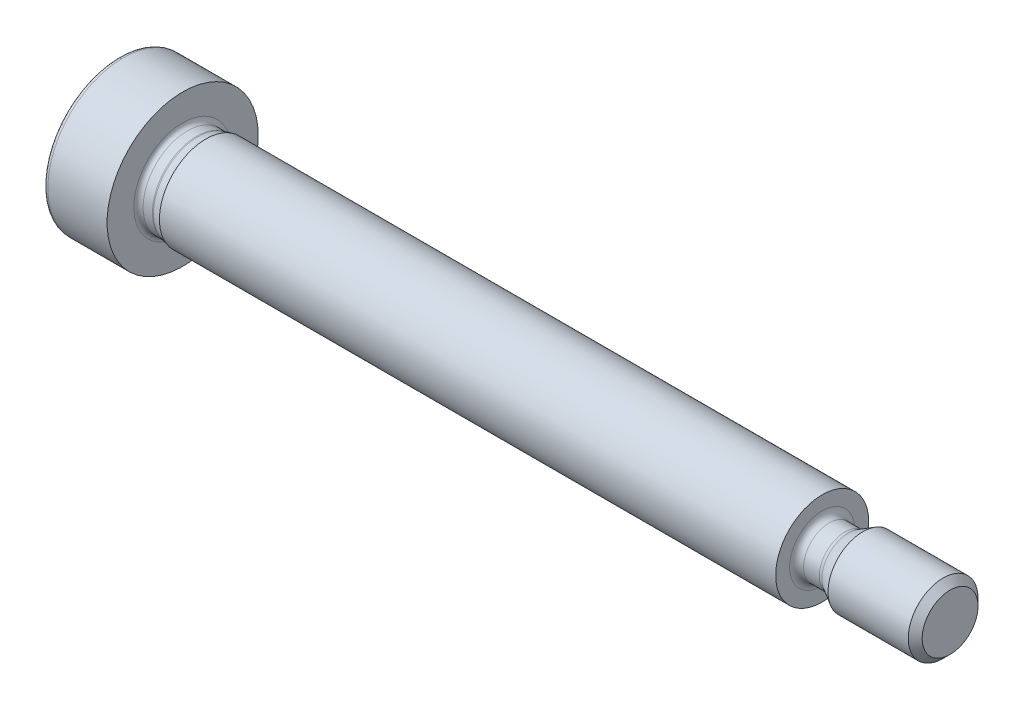
ISO-10303-21;
HEADER;
FILE_DESCRIPTION(('STEP AP214'),'2;1');
FILE_NAME('part.step','',(''),(''),'','','');
FILE_SCHEMA(('AUTOMOTIVE_DESIGN { 1 0 10303 214 1 1 1 1 }'));
ENDSEC;
DATA;
#1=APPLICATION_CONTEXT('core data for automotive mechanical design processes');
#2=APPLICATION_PROTOCOL_DEFINITION('international standard','automotive_design',2000,#1);
#3=PRODUCT_CONTEXT('',#1,'mechanical');
#4=PRODUCT('Part','Part','',(#3));
#5=PRODUCT_RELATED_PRODUCT_CATEGORY('part','',(#4));
#6=PRODUCT_DEFINITION_FORMATION('','',#4);
#7=PRODUCT_DEFINITION_CONTEXT('part definition',#1,'design');
#8=PRODUCT_DEFINITION('design','',#6,#7);
#9=PRODUCT_DEFINITION_SHAPE('','',#8);
#10=(LENGTH_UNIT() NAMED_UNIT(*) SI_UNIT(.MILLI.,.METRE.));
#11=(NAMED_UNIT(*) PLANE_ANGLE_UNIT() SI_UNIT($,.RADIAN.));
#12=(NAMED_UNIT(*) SI_UNIT($,.STERADIAN.) SOLID_ANGLE_UNIT());
#13=UNCERTAINTY_MEASURE_WITH_UNIT(LENGTH_MEASURE(1.E-05),#10,'distance_accuracy_value','');
#14=(GEOMETRIC_REPRESENTATION_CONTEXT(3) GLOBAL_UNCERTAINTY_ASSIGNED_CONTEXT((#13)) GLOBAL_UNIT_ASSIGNED_CONTEXT((#10,
#11,#12)) REPRESENTATION_CONTEXT('',''));
#15=CARTESIAN_POINT('',(0.,0.,0.));
#16=DIRECTION('',(0.,0.,1.));
#17=DIRECTION('',(1.,0.,0.));
#18=AXIS2_PLACEMENT_3D('',#15,#16,#17);
#19=CARTESIAN_POINT('',(-2.2,0.,0.));
#20=DIRECTION('',(1.,0.,0.));
#21=DIRECTION('',(0.,1.,0.));
#22=AXIS2_PLACEMENT_3D('',#19,#20,#21);
#23=PLANE('',#22);
#24=DIRECTION('',(0.,-1.,0.));
#25=VECTOR('',#24,1.);
#26=CARTESIAN_POINT('',(-2.2,1.15470053837925,2.));
#27=LINE('',#26,#25);
#28=CARTESIAN_POINT('',(-2.2,1.15470053837925,2.));
#29=VERTEX_POINT('',#28);
#30=CARTESIAN_POINT('',(-2.2,-1.15470053837925,2.));
#31=VERTEX_POINT('',#30);
#32=EDGE_CURVE('E232',#29,#31,#27,.T.);
#33=ORIENTED_EDGE('',*,*,#32,.F.);
#34=DIRECTION('',(0.,-0.5,0.866025403784439));
#35=VECTOR('',#34,1.);
#36=CARTESIAN_POINT('',(-2.2,2.3094010767585,0.));
#37=LINE('',#36,#35);
#38=CARTESIAN_POINT('',(-2.2,2.3094010767585,0.));
#39=VERTEX_POINT('',#38);
#40=EDGE_CURVE('E11',#39,#29,#37,.T.);
#41=ORIENTED_EDGE('',*,*,#40,.F.);
#42=DIRECTION('',(0.,0.5,0.866025403784439));
#43=VECTOR('',#42,1.);
#44=CARTESIAN_POINT('',(-2.2,1.15470053837925,-2.));
#45=LINE('',#44,#43);
#46=CARTESIAN_POINT('',(-2.2,1.15470053837925,-2.));
#47=VERTEX_POINT('',#46);
#48=EDGE_CURVE('E43',#47,#39,#45,.T.);
#49=ORIENTED_EDGE('',*,*,#48,.F.);
#50=DIRECTION('',(0.,1.,0.));
#51=VECTOR('',#50,1.);
#52=CARTESIAN_POINT('',(-2.2,-1.15470053837925,-2.));
#53=LINE('',#52,#51);
#54=CARTESIAN_POINT('',(-2.2,-1.15470053837925,-2.));
#55=VERTEX_POINT('',#54);
#56=EDGE_CURVE('E188',#55,#47,#53,.T.);
#57=ORIENTED_EDGE('',*,*,#56,.F.);
#58=DIRECTION('',(0.,0.5,-0.866025403784439));
#59=VECTOR('',#58,1.);
#60=CARTESIAN_POINT('',(-2.2,-2.3094010767585,0.));
#61=LINE('',#60,#59);
#62=CARTESIAN_POINT('',(-2.2,-2.3094010767585,0.));
#63=VERTEX_POINT('',#62);
#64=EDGE_CURVE('E248',#63,#55,#61,.T.);
#65=ORIENTED_EDGE('',*,*,#64,.F.);
#66=DIRECTION('',(0.,-0.5,-0.866025403784439));
#67=VECTOR('',#66,1.);
#68=CARTESIAN_POINT('',(-2.2,-1.15470053837925,2.));
#69=LINE('',#68,#67);
#70=EDGE_CURVE('E241',#31,#63,#69,.T.);
#71=ORIENTED_EDGE('',*,*,#70,.F.);
#72=EDGE_LOOP('',(#33,#41,#49,#57,#65,#71));
#73=FACE_BOUND('',#72,.T.);
#74=ADVANCED_FACE('F17',(#73),#23,.F.);
#75=CARTESIAN_POINT('',(-2.2,2.3094010767585,0.));
#76=DIRECTION('',(0.,-0.866025403784439,-0.5));
#77=DIRECTION('',(0.,0.5,-0.866025403784439));
#78=AXIS2_PLACEMENT_3D('',#75,#76,#77);
#79=PLANE('',#78);
#80=DIRECTION('',(0.,-0.5,0.866025403784439));
#81=VECTOR('',#80,1.);
#82=CARTESIAN_POINT('',(-5.5,2.3094010767585,0.));
#83=LINE('',#82,#81);
#84=CARTESIAN_POINT('',(-5.5,2.3094010767585,0.));
#85=VERTEX_POINT('',#84);
#86=CARTESIAN_POINT('',(-5.5,1.15470053837925,2.));
#87=VERTEX_POINT('',#86);
#88=EDGE_CURVE('E185',#85,#87,#83,.T.);
#89=ORIENTED_EDGE('',*,*,#88,.F.);
#90=DIRECTION('',(-1.,0.,0.));
#91=VECTOR('',#90,1.);
#92=CARTESIAN_POINT('',(-2.2,2.3094010767585,0.));
#93=LINE('',#92,#91);
#94=EDGE_CURVE('E20',#39,#85,#93,.T.);
#95=ORIENTED_EDGE('',*,*,#94,.F.);
#96=ORIENTED_EDGE('',*,*,#40,.T.);
#97=DIRECTION('',(-1.,0.,0.));
#98=VECTOR('',#97,1.);
#99=CARTESIAN_POINT('',(-2.2,1.15470053837925,2.));
#100=LINE('',#99,#98);
#101=EDGE_CURVE('E231',#29,#87,#100,.T.);
#102=ORIENTED_EDGE('',*,*,#101,.T.);
#103=EDGE_LOOP('',(#89,#95,#96,#102));
#104=FACE_BOUND('',#103,.T.);
#105=ADVANCED_FACE('F264',(#104),#79,.T.);
#106=CARTESIAN_POINT('',(-2.2,1.15470053837925,-2.));
#107=DIRECTION('',(0.,-0.866025403784439,0.5));
#108=DIRECTION('',(-1.,0.,0.));
#109=AXIS2_PLACEMENT_3D('',#106,#107,#108);
#110=PLANE('',#109);
#111=DIRECTION('',(0.,0.5,0.866025403784439));
#112=VECTOR('',#111,1.);
#113=CARTESIAN_POINT('',(-5.5,1.15470053837925,-2.));
#114=LINE('',#113,#112);
#115=CARTESIAN_POINT('',(-5.5,1.15470053837925,-2.));
#116=VERTEX_POINT('',#115);
#117=EDGE_CURVE('E180',#116,#85,#114,.T.);
#118=ORIENTED_EDGE('',*,*,#117,.F.);
#119=DIRECTION('',(-1.,0.,0.));
#120=VECTOR('',#119,1.);
#121=CARTESIAN_POINT('',(-2.2,1.15470053837925,-2.));
#122=LINE('',#121,#120);
#123=EDGE_CURVE('E193',#47,#116,#122,.T.);
#124=ORIENTED_EDGE('',*,*,#123,.F.);
#125=ORIENTED_EDGE('',*,*,#48,.T.);
#126=ORIENTED_EDGE('',*,*,#94,.T.);
#127=EDGE_LOOP('',(#118,#124,#125,#126));
#128=FACE_BOUND('',#127,.T.);
#129=ADVANCED_FACE('F263',(#128),#110,.T.);
#130=CARTESIAN_POINT('',(-2.2,-1.15470053837925,-2.));
#131=DIRECTION('',(0.,0.,1.));
#132=DIRECTION('',(1.,0.,0.));
#133=AXIS2_PLACEMENT_3D('',#130,#131,#132);
#134=PLANE('',#133);
#135=DIRECTION('',(0.,1.,0.));
#136=VECTOR('',#135,1.);
#137=CARTESIAN_POINT('',(-5.5,-1.15470053837925,-2.));
#138=LINE('',#137,#136);
#139=CARTESIAN_POINT('',(-5.5,-1.15470053837925,-2.));
#140=VERTEX_POINT('',#139);
#141=EDGE_CURVE('E174',#140,#116,#138,.T.);
#142=ORIENTED_EDGE('',*,*,#141,.F.);
#143=DIRECTION('',(-1.,0.,0.));
#144=VECTOR('',#143,1.);
#145=CARTESIAN_POINT('',(-2.2,-1.15470053837925,-2.));
#146=LINE('',#145,#144);
#147=EDGE_CURVE('E192',#55,#140,#146,.T.);
#148=ORIENTED_EDGE('',*,*,#147,.F.);
#149=ORIENTED_EDGE('',*,*,#56,.T.);
#150=ORIENTED_EDGE('',*,*,#123,.T.);
#151=EDGE_LOOP('',(#142,#148,#149,#150));
#152=FACE_BOUND('',#151,.T.);
#153=ADVANCED_FACE('F273',(#152),#134,.T.);
#154=CARTESIAN_POINT('',(-2.2,-2.3094010767585,0.));
#155=DIRECTION('',(0.,0.866025403784439,0.5));
#156=DIRECTION('',(1.,0.,0.));
#157=AXIS2_PLACEMENT_3D('',#154,#155,#156);
#158=PLANE('',#157);
#159=DIRECTION('',(0.,0.5,-0.866025403784439));
#160=VECTOR('',#159,1.);
#161=CARTESIAN_POINT('',(-5.5,-2.3094010767585,0.));
#162=LINE('',#161,#160);
#163=CARTESIAN_POINT('',(-5.5,-2.3094010767585,0.));
#164=VERTEX_POINT('',#163);
#165=EDGE_CURVE('E166',#164,#140,#162,.T.);
#166=ORIENTED_EDGE('',*,*,#165,.F.);
#167=DIRECTION('',(-1.,0.,0.));
#168=VECTOR('',#167,1.);
#169=CARTESIAN_POINT('',(-2.2,-2.3094010767585,0.));
#170=LINE('',#169,#168);
#171=EDGE_CURVE('E244',#63,#164,#170,.T.);
#172=ORIENTED_EDGE('',*,*,#171,.F.);
#173=ORIENTED_EDGE('',*,*,#64,.T.);
#174=ORIENTED_EDGE('',*,*,#147,.T.);
#175=EDGE_LOOP('',(#166,#172,#173,#174));
#176=FACE_BOUND('',#175,.T.);
#177=ADVANCED_FACE('F279',(#176),#158,.T.);
#178=CARTESIAN_POINT('',(-2.2,-1.15470053837925,2.));
#179=DIRECTION('',(0.,0.866025403784439,-0.5));
#180=DIRECTION('',(-1.,0.,0.));
#181=AXIS2_PLACEMENT_3D('',#178,#179,#180);
#182=PLANE('',#181);
#183=DIRECTION('',(0.,-0.5,-0.866025403784439));
#184=VECTOR('',#183,1.);
#185=CARTESIAN_POINT('',(-5.5,-1.15470053837925,2.));
#186=LINE('',#185,#184);
#187=CARTESIAN_POINT('',(-5.5,-1.15470053837925,2.));
#188=VERTEX_POINT('',#187);
#189=EDGE_CURVE('E158',#188,#164,#186,.T.);
#190=ORIENTED_EDGE('',*,*,#189,.F.);
#191=DIRECTION('',(-1.,0.,0.));
#192=VECTOR('',#191,1.);
#193=CARTESIAN_POINT('',(-2.2,-1.15470053837925,2.));
#194=LINE('',#193,#192);
#195=EDGE_CURVE('E238',#31,#188,#194,.T.);
#196=ORIENTED_EDGE('',*,*,#195,.F.);
#197=ORIENTED_EDGE('',*,*,#70,.T.);
#198=ORIENTED_EDGE('',*,*,#171,.T.);
#199=EDGE_LOOP('',(#190,#196,#197,#198));
#200=FACE_BOUND('',#199,.T.);
#201=ADVANCED_FACE('F281',(#200),#182,.T.);
#202=CARTESIAN_POINT('',(-2.2,1.15470053837925,2.));
#203=DIRECTION('',(0.,0.,-1.));
#204=DIRECTION('',(0.,-1.,0.));
#205=AXIS2_PLACEMENT_3D('',#202,#203,#204);
#206=PLANE('',#205);
#207=DIRECTION('',(0.,-1.,0.));
#208=VECTOR('',#207,1.);
#209=CARTESIAN_POINT('',(-5.5,1.15470053837925,2.));
#210=LINE('',#209,#208);
#211=EDGE_CURVE('E153',#87,#188,#210,.T.);
#212=ORIENTED_EDGE('',*,*,#211,.F.);
#213=ORIENTED_EDGE('',*,*,#101,.F.);
#214=ORIENTED_EDGE('',*,*,#32,.T.);
#215=ORIENTED_EDGE('',*,*,#195,.T.);
#216=EDGE_LOOP('',(#212,#213,#214,#215));
#217=FACE_BOUND('',#216,.T.);
#218=ADVANCED_FACE('F284',(#217),#206,.T.);
#219=CARTESIAN_POINT('',(66.,2.4,0.));
#220=DIRECTION('',(-1.,0.,0.));
#221=DIRECTION('',(0.,0.,1.));
#222=AXIS2_PLACEMENT_3D('',#219,#220,#221);
#223=PLANE('',#222);
#224=CARTESIAN_POINT('',(66.,0.,0.));
#225=DIRECTION('',(1.,0.,0.));
#226=DIRECTION('',(0.,0.,-1.));
#227=AXIS2_PLACEMENT_3D('',#224,#225,#226);
#228=CIRCLE('',#227,2.4);
#229=CARTESIAN_POINT('',(66.,0.,-2.4));
#230=VERTEX_POINT('',#229);
#231=EDGE_CURVE('E229',#230,#230,#228,.T.);
#232=ORIENTED_EDGE('',*,*,#231,.T.);
#233=EDGE_LOOP('',(#232));
#234=FACE_BOUND('',#233,.T.);
#235=ADVANCED_FACE('F285',(#234),#223,.F.);
#236=CARTESIAN_POINT('',(65.4,0.,0.));
#237=DIRECTION('',(-1.,0.,0.));
#238=DIRECTION('',(0.,0.,1.));
#239=AXIS2_PLACEMENT_3D('',#236,#237,#238);
#240=CONICAL_SURFACE('',#239,3.,0.785398163397457);
#241=CARTESIAN_POINT('',(65.4,0.,0.));
#242=DIRECTION('',(1.,0.,0.));
#243=DIRECTION('',(0.,0.,-1.));
#244=AXIS2_PLACEMENT_3D('',#241,#242,#243);
#245=CIRCLE('',#244,3.);
#246=CARTESIAN_POINT('',(65.4,0.,-3.));
#247=VERTEX_POINT('',#246);
#248=EDGE_CURVE('E223',#247,#247,#245,.T.);
#249=ORIENTED_EDGE('',*,*,#248,.T.);
#250=EDGE_LOOP('',(#249));
#251=FACE_BOUND('',#250,.T.);
#252=ORIENTED_EDGE('',*,*,#231,.F.);
#253=EDGE_LOOP('',(#252));
#254=FACE_BOUND('',#253,.T.);
#255=ADVANCED_FACE('F291',(#251,#254),#240,.T.);
#256=CARTESIAN_POINT('',(66.,0.,0.));
#257=DIRECTION('',(1.,0.,0.));
#258=DIRECTION('',(0.,0.,-1.));
#259=AXIS2_PLACEMENT_3D('',#256,#257,#258);
#260=CYLINDRICAL_SURFACE('',#259,3.);
#261=CARTESIAN_POINT('',(58.5,0.,0.));
#262=DIRECTION('',(1.,0.,0.));
#263=DIRECTION('',(0.,0.,-1.));
#264=AXIS2_PLACEMENT_3D('',#261,#262,#263);
#265=CIRCLE('',#264,3.);
#266=CARTESIAN_POINT('',(58.5,0.,-3.));
#267=VERTEX_POINT('',#266);
#268=EDGE_CURVE('E225',#267,#267,#265,.T.);
#269=ORIENTED_EDGE('',*,*,#268,.T.);
#270=EDGE_LOOP('',(#269));
#271=FACE_BOUND('',#270,.T.);
#272=ORIENTED_EDGE('',*,*,#248,.F.);
#273=EDGE_LOOP('',(#272));
#274=FACE_BOUND('',#273,.T.);
#275=ADVANCED_FACE('F345',(#271,#274),#260,.T.);
#276=CARTESIAN_POINT('',(57.2535898384862,0.,0.));
#277=DIRECTION('',(1.,0.,0.));
#278=DIRECTION('',(0.,0.,-1.));
#279=AXIS2_PLACEMENT_3D('',#276,#277,#278);
#280=CONICAL_SURFACE('',#279,2.28038475772934,0.523598775598299);
#281=CARTESIAN_POINT('',(57.2535898384862,0.,0.));
#282=DIRECTION('',(1.,0.,0.));
#283=DIRECTION('',(0.,0.,-1.));
#284=AXIS2_PLACEMENT_3D('',#281,#282,#283);
#285=CIRCLE('',#284,2.28038475772934);
#286=CARTESIAN_POINT('',(57.2535898384862,0.,-2.28038475772934));
#287=VERTEX_POINT('',#286);
#288=EDGE_CURVE('E218',#287,#287,#285,.T.);
#289=ORIENTED_EDGE('',*,*,#288,.T.);
#290=EDGE_LOOP('',(#289));
#291=FACE_BOUND('',#290,.T.);
#292=ORIENTED_EDGE('',*,*,#268,.F.);
#293=EDGE_LOOP('',(#292));
#294=FACE_BOUND('',#293,.T.);
#295=ADVANCED_FACE('F355',(#291,#294),#280,.T.);
#296=CARTESIAN_POINT('',(56.9535898384862,0.,0.));
#297=DIRECTION('',(1.,0.,0.));
#298=DIRECTION('',(0.,0.,-1.));
#299=AXIS2_PLACEMENT_3D('',#296,#297,#298);
#300=TOROIDAL_SURFACE('',#299,2.8,0.599999999999966);
#301=CARTESIAN_POINT('',(56.9535898384862,0.,0.));
#302=DIRECTION('',(1.,0.,0.));
#303=DIRECTION('',(0.,0.,-1.));
#304=AXIS2_PLACEMENT_3D('',#301,#302,#303);
#305=CIRCLE('',#304,2.2);
#306=CARTESIAN_POINT('',(56.9535898384862,0.,-2.2));
#307=VERTEX_POINT('',#306);
#308=EDGE_CURVE('E216',#307,#307,#305,.T.);
#309=ORIENTED_EDGE('',*,*,#308,.T.);
#310=EDGE_LOOP('',(#309));
#311=FACE_BOUND('',#310,.T.);
#312=ORIENTED_EDGE('',*,*,#288,.F.);
#313=EDGE_LOOP('',(#312));
#314=FACE_BOUND('',#313,.T.);
#315=ADVANCED_FACE('F362',(#311,#314),#300,.F.);
#316=CARTESIAN_POINT('',(66.,0.,0.));
#317=DIRECTION('',(1.,0.,0.));
#318=DIRECTION('',(0.,0.,-1.));
#319=AXIS2_PLACEMENT_3D('',#316,#317,#318);
#320=CYLINDRICAL_SURFACE('',#319,2.2);
#321=CARTESIAN_POINT('',(55.6,0.,0.));
#322=DIRECTION('',(1.,0.,0.));
#323=DIRECTION('',(0.,0.,-1.));
#324=AXIS2_PLACEMENT_3D('',#321,#322,#323);
#325=CIRCLE('',#324,2.2);
#326=CARTESIAN_POINT('',(55.6,0.,-2.2));
#327=VERTEX_POINT('',#326);
#328=EDGE_CURVE('E207',#327,#327,#325,.T.);
#329=ORIENTED_EDGE('',*,*,#328,.T.);
#330=EDGE_LOOP('',(#329));
#331=FACE_BOUND('',#330,.T.);
#332=ORIENTED_EDGE('',*,*,#308,.F.);
#333=EDGE_LOOP('',(#332));
#334=FACE_BOUND('',#333,.T.);
#335=ADVANCED_FACE('F373',(#331,#334),#320,.T.);
#336=CARTESIAN_POINT('',(55.6,0.,0.));
#337=DIRECTION('',(1.,0.,0.));
#338=DIRECTION('',(0.,0.,-1.));
#339=AXIS2_PLACEMENT_3D('',#336,#337,#338);
#340=TOROIDAL_SURFACE('',#339,2.8,0.6);
#341=CARTESIAN_POINT('',(55.,0.,0.));
#342=DIRECTION('',(1.,0.,0.));
#343=DIRECTION('',(0.,0.,-1.));
#344=AXIS2_PLACEMENT_3D('',#341,#342,#343);
#345=CIRCLE('',#344,2.8);
#346=CARTESIAN_POINT('',(55.,0.,-2.8));
#347=VERTEX_POINT('',#346);
#348=EDGE_CURVE('E163',#347,#347,#345,.T.);
#349=ORIENTED_EDGE('',*,*,#348,.T.);
#350=EDGE_LOOP('',(#349));
#351=FACE_BOUND('',#350,.T.);
#352=ORIENTED_EDGE('',*,*,#328,.F.);
#353=EDGE_LOOP('',(#352));
#354=FACE_BOUND('',#353,.T.);
#355=ADVANCED_FACE('F383',(#351,#354),#340,.F.);
#356=CARTESIAN_POINT('',(55.,4.,0.));
#357=DIRECTION('',(-1.,0.,0.));
#358=DIRECTION('',(0.,0.,1.));
#359=AXIS2_PLACEMENT_3D('',#356,#357,#358);
#360=PLANE('',#359);
#361=ORIENTED_EDGE('',*,*,#348,.F.);
#362=EDGE_LOOP('',(#361));
#363=FACE_BOUND('',#362,.T.);
#364=CARTESIAN_POINT('',(55.,0.,0.));
#365=DIRECTION('',(1.,0.,0.));
#366=DIRECTION('',(0.,0.,-1.));
#367=AXIS2_PLACEMENT_3D('',#364,#365,#366);
#368=CIRCLE('',#367,4.);
#369=CARTESIAN_POINT('',(55.,0.,-4.));
#370=VERTEX_POINT('',#369);
#371=EDGE_CURVE('E161',#370,#370,#368,.T.);
#372=ORIENTED_EDGE('',*,*,#371,.T.);
#373=EDGE_LOOP('',(#372));
#374=FACE_BOUND('',#373,.T.);
#375=ADVANCED_FACE('F395',(#363,#374),#360,.F.);
#376=CARTESIAN_POINT('',(55.,0.,0.));
#377=DIRECTION('',(1.,0.,0.));
#378=DIRECTION('',(0.,0.,-1.));
#379=AXIS2_PLACEMENT_3D('',#376,#377,#378);
#380=CYLINDRICAL_SURFACE('',#379,4.);
#381=CARTESIAN_POINT('',(2.,0.,0.));
#382=DIRECTION('',(1.,0.,0.));
#383=DIRECTION('',(0.,0.,-1.));
#384=AXIS2_PLACEMENT_3D('',#381,#382,#383);
#385=CIRCLE('',#384,4.);
#386=CARTESIAN_POINT('',(2.,0.,-4.));
#387=VERTEX_POINT('',#386);
#388=EDGE_CURVE('E164',#387,#387,#385,.T.);
#389=ORIENTED_EDGE('',*,*,#388,.T.);
#390=EDGE_LOOP('',(#389));
#391=FACE_BOUND('',#390,.T.);
#392=ORIENTED_EDGE('',*,*,#371,.F.);
#393=EDGE_LOOP('',(#392));
#394=FACE_BOUND('',#393,.T.);
#395=ADVANCED_FACE('F406',(#391,#394),#380,.T.);
#396=CARTESIAN_POINT('',(1.30445645749228,0.,0.));
#397=DIRECTION('',(1.,0.,0.));
#398=DIRECTION('',(0.,0.,-1.));
#399=AXIS2_PLACEMENT_3D('',#396,#397,#398);
#400=CONICAL_SURFACE('',#399,3.81362966948437,0.261799387799149);
#401=CARTESIAN_POINT('',(1.30445645749228,0.,0.));
#402=DIRECTION('',(1.,0.,0.));
#403=DIRECTION('',(0.,0.,-1.));
#404=AXIS2_PLACEMENT_3D('',#401,#402,#403);
#405=CIRCLE('',#404,3.81362966948437);
#406=CARTESIAN_POINT('',(1.30445645749228,0.,-3.81362966948437));
#407=VERTEX_POINT('',#406);
#408=EDGE_CURVE('E201',#407,#407,#405,.T.);
#409=ORIENTED_EDGE('',*,*,#408,.T.);
#410=EDGE_LOOP('',(#409));
#411=FACE_BOUND('',#410,.T.);
#412=ORIENTED_EDGE('',*,*,#388,.F.);
#413=EDGE_LOOP('',(#412));
#414=FACE_BOUND('',#413,.T.);
#415=ADVANCED_FACE('F414',(#411,#414),#400,.T.);
#416=CARTESIAN_POINT('',(1.20092883945126,0.,0.));
#417=DIRECTION('',(1.,0.,0.));
#418=DIRECTION('',(0.,0.,-1.));
#419=AXIS2_PLACEMENT_3D('',#416,#417,#418);
#420=TOROIDAL_SURFACE('',#419,4.2,0.400000000000041);
#421=CARTESIAN_POINT('',(1.20092883945126,0.,0.));
#422=DIRECTION('',(1.,0.,0.));
#423=DIRECTION('',(0.,0.,-1.));
#424=AXIS2_PLACEMENT_3D('',#421,#422,#423);
#425=CIRCLE('',#424,3.8);
#426=CARTESIAN_POINT('',(1.20092883945126,0.,-3.8));
#427=VERTEX_POINT('',#426);
#428=EDGE_CURVE('E206',#427,#427,#425,.T.);
#429=ORIENTED_EDGE('',*,*,#428,.T.);
#430=EDGE_LOOP('',(#429));
#431=FACE_BOUND('',#430,.T.);
#432=ORIENTED_EDGE('',*,*,#408,.F.);
#433=EDGE_LOOP('',(#432));
#434=FACE_BOUND('',#433,.T.);
#435=ADVANCED_FACE('F424',(#431,#434),#420,.F.);
#436=CARTESIAN_POINT('',(55.,0.,0.));
#437=DIRECTION('',(1.,0.,0.));
#438=DIRECTION('',(0.,0.,-1.));
#439=AXIS2_PLACEMENT_3D('',#436,#437,#438);
#440=CYLINDRICAL_SURFACE('',#439,3.8);
#441=CARTESIAN_POINT('',(0.4,0.,0.));
#442=DIRECTION('',(1.,0.,0.));
#443=DIRECTION('',(0.,0.,-1.));
#444=AXIS2_PLACEMENT_3D('',#441,#442,#443);
#445=CIRCLE('',#444,3.8);
#446=CARTESIAN_POINT('',(0.4,0.,-3.8));
#447=VERTEX_POINT('',#446);
#448=EDGE_CURVE('E199',#447,#447,#445,.T.);
#449=ORIENTED_EDGE('',*,*,#448,.T.);
#450=EDGE_LOOP('',(#449));
#451=FACE_BOUND('',#450,.T.);
#452=ORIENTED_EDGE('',*,*,#428,.F.);
#453=EDGE_LOOP('',(#452));
#454=FACE_BOUND('',#453,.T.);
#455=ADVANCED_FACE('F432',(#451,#454),#440,.T.);
#456=CARTESIAN_POINT('',(0.4,0.,0.));
#457=DIRECTION('',(1.,0.,0.));
#458=DIRECTION('',(0.,0.,-1.));
#459=AXIS2_PLACEMENT_3D('',#456,#457,#458);
#460=TOROIDAL_SURFACE('',#459,4.2,0.4);
#461=CARTESIAN_POINT('',(0.,0.,0.));
#462=DIRECTION('',(1.,0.,0.));
#463=DIRECTION('',(0.,0.,-1.));
#464=AXIS2_PLACEMENT_3D('',#461,#462,#463);
#465=CIRCLE('',#464,4.2);
#466=CARTESIAN_POINT('',(0.,0.,-4.2));
#467=VERTEX_POINT('',#466);
#468=EDGE_CURVE('E197',#467,#467,#465,.T.);
#469=ORIENTED_EDGE('',*,*,#468,.T.);
#470=EDGE_LOOP('',(#469));
#471=FACE_BOUND('',#470,.T.);
#472=ORIENTED_EDGE('',*,*,#448,.F.);
#473=EDGE_LOOP('',(#472));
#474=FACE_BOUND('',#473,.T.);
#475=ADVANCED_FACE('F441',(#471,#474),#460,.F.);
#476=CARTESIAN_POINT('',(0.,6.5,0.));
#477=DIRECTION('',(-1.,0.,0.));
#478=DIRECTION('',(0.,0.,1.));
#479=AXIS2_PLACEMENT_3D('',#476,#477,#478);
#480=PLANE('',#479);
#481=CARTESIAN_POINT('',(0.,0.,0.));
#482=DIRECTION('',(1.,0.,0.));
#483=DIRECTION('',(0.,0.,-1.));
#484=AXIS2_PLACEMENT_3D('',#481,#482,#483);
#485=CIRCLE('',#484,6.5);
#486=CARTESIAN_POINT('',(0.,0.,-6.5));
#487=VERTEX_POINT('',#486);
#488=EDGE_CURVE('E187',#487,#487,#485,.T.);
#489=ORIENTED_EDGE('',*,*,#488,.T.);
#490=EDGE_LOOP('',(#489));
#491=FACE_BOUND('',#490,.T.);
#492=ORIENTED_EDGE('',*,*,#468,.F.);
#493=EDGE_LOOP('',(#492));
#494=FACE_BOUND('',#493,.T.);
#495=ADVANCED_FACE('F452',(#491,#494),#480,.F.);
#496=CARTESIAN_POINT('',(55.,0.,0.));
#497=DIRECTION('',(1.,0.,0.));
#498=DIRECTION('',(0.,0.,-1.));
#499=AXIS2_PLACEMENT_3D('',#496,#497,#498);
#500=CYLINDRICAL_SURFACE('',#499,6.5);
#501=CARTESIAN_POINT('',(-5.1,0.,0.));
#502=DIRECTION('',(1.,0.,0.));
#503=DIRECTION('',(0.,0.,-1.));
#504=AXIS2_PLACEMENT_3D('',#501,#502,#503);
#505=CIRCLE('',#504,6.5);
#506=CARTESIAN_POINT('',(-5.1,0.,-6.5));
#507=VERTEX_POINT('',#506);
#508=EDGE_CURVE('E184',#507,#507,#505,.T.);
#509=ORIENTED_EDGE('',*,*,#508,.T.);
#510=EDGE_LOOP('',(#509));
#511=FACE_BOUND('',#510,.T.);
#512=ORIENTED_EDGE('',*,*,#488,.F.);
#513=EDGE_LOOP('',(#512));
#514=FACE_BOUND('',#513,.T.);
#515=ADVANCED_FACE('F463',(#511,#514),#500,.T.);
#516=CARTESIAN_POINT('',(-5.1,0.,0.));
#517=DIRECTION('',(1.,0.,0.));
#518=DIRECTION('',(0.,0.,-1.));
#519=AXIS2_PLACEMENT_3D('',#516,#517,#518);
#520=TOROIDAL_SURFACE('',#519,6.1,0.4);
#521=ORIENTED_EDGE('',*,*,#508,.F.);
#522=EDGE_LOOP('',(#521));
#523=FACE_BOUND('',#522,.T.);
#524=CARTESIAN_POINT('',(-5.5,0.,0.));
#525=DIRECTION('',(1.,0.,0.));
#526=DIRECTION('',(0.,0.,-1.));
#527=AXIS2_PLACEMENT_3D('',#524,#525,#526);
#528=CIRCLE('',#527,6.1);
#529=CARTESIAN_POINT('',(-5.5,0.,-6.1));
#530=VERTEX_POINT('',#529);
#531=EDGE_CURVE('E149',#530,#530,#528,.T.);
#532=ORIENTED_EDGE('',*,*,#531,.T.);
#533=EDGE_LOOP('',(#532));
#534=FACE_BOUND('',#533,.T.);
#535=ADVANCED_FACE('F147',(#523,#534),#520,.T.);
#536=CARTESIAN_POINT('',(-5.5,0.,0.));
#537=DIRECTION('',(1.,0.,0.));
#538=DIRECTION('',(0.,1.,0.));
#539=AXIS2_PLACEMENT_3D('',#536,#537,#538);
#540=PLANE('',#539);
#541=ORIENTED_EDGE('',*,*,#211,.T.);
#542=ORIENTED_EDGE('',*,*,#189,.T.);
#543=ORIENTED_EDGE('',*,*,#165,.T.);
#544=ORIENTED_EDGE('',*,*,#141,.T.);
#545=ORIENTED_EDGE('',*,*,#117,.T.);
#546=ORIENTED_EDGE('',*,*,#88,.T.);
#547=EDGE_LOOP('',(#541,#542,#543,#544,#545,#546));
#548=FACE_BOUND('',#547,.T.);
#549=ORIENTED_EDGE('',*,*,#531,.F.);
#550=EDGE_LOOP('',(#549));
#551=FACE_BOUND('',#550,.T.);
#552=ADVANCED_FACE('F267',(#548,#551),#540,.F.);
#553=CLOSED_SHELL('',(#74,#105,#129,#153,#177,#201,#218,#235,#255,#275,#295,#315,#335,#355,#375,
#395,#415,#435,#455,#475,#495,#515,#535,#552));
#554=MANIFOLD_SOLID_BREP('B1',#553);
#555=ADVANCED_BREP_SHAPE_REPRESENTATION('',(#18,#554),#14);
#556=SHAPE_DEFINITION_REPRESENTATION(#9,#555);
ENDSEC;
END-ISO-10303-21;
